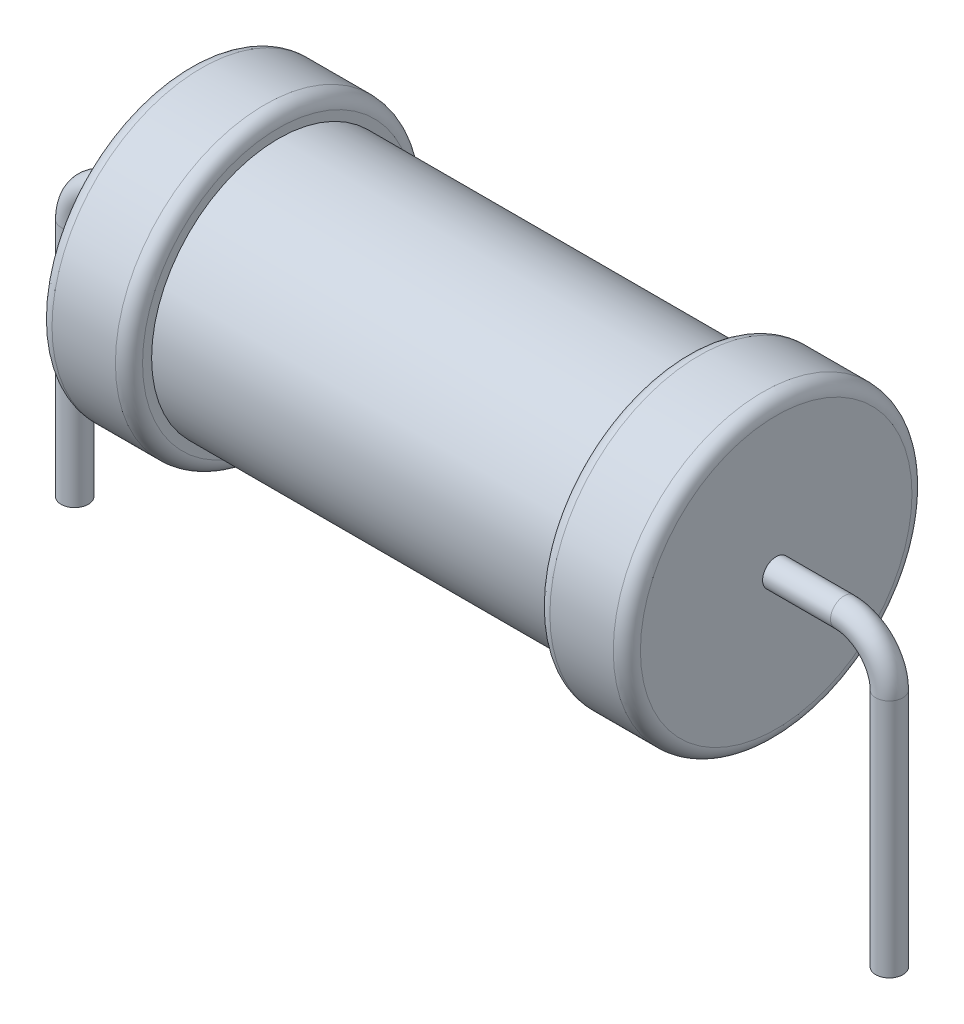
ISO-10303-21;
HEADER;
FILE_DESCRIPTION(('STEP AP214'),'2;1');
FILE_NAME('part.step','',(''),(''),'','','');
FILE_SCHEMA(('AUTOMOTIVE_DESIGN { 1 0 10303 214 1 1 1 1 }'));
ENDSEC;
DATA;
#1=APPLICATION_CONTEXT('core data for automotive mechanical design processes');
#2=APPLICATION_PROTOCOL_DEFINITION('international standard','automotive_design',2000,#1);
#3=PRODUCT_CONTEXT('',#1,'mechanical');
#4=PRODUCT('Part','Part','',(#3));
#5=PRODUCT_RELATED_PRODUCT_CATEGORY('part','',(#4));
#6=PRODUCT_DEFINITION_FORMATION('','',#4);
#7=PRODUCT_DEFINITION_CONTEXT('part definition',#1,'design');
#8=PRODUCT_DEFINITION('design','',#6,#7);
#9=PRODUCT_DEFINITION_SHAPE('','',#8);
#10=(LENGTH_UNIT() NAMED_UNIT(*) SI_UNIT(.MILLI.,.METRE.));
#11=(NAMED_UNIT(*) PLANE_ANGLE_UNIT() SI_UNIT($,.RADIAN.));
#12=(NAMED_UNIT(*) SI_UNIT($,.STERADIAN.) SOLID_ANGLE_UNIT());
#13=UNCERTAINTY_MEASURE_WITH_UNIT(LENGTH_MEASURE(1.E-05),#10,'distance_accuracy_value','');
#14=(GEOMETRIC_REPRESENTATION_CONTEXT(3) GLOBAL_UNCERTAINTY_ASSIGNED_CONTEXT((#13)) GLOBAL_UNIT_ASSIGNED_CONTEXT((#10,
#11,#12)) REPRESENTATION_CONTEXT('',''));
#15=CARTESIAN_POINT('',(0.,0.,0.));
#16=DIRECTION('',(0.,0.,1.));
#17=DIRECTION('',(1.,0.,0.));
#18=AXIS2_PLACEMENT_3D('',#15,#16,#17);
#19=CARTESIAN_POINT('',(0.,0.,0.));
#20=DIRECTION('',(1.,0.,0.));
#21=DIRECTION('',(0.,0.,-1.));
#22=AXIS2_PLACEMENT_3D('',#19,#20,#21);
#23=PLANE('',#22);
#24=CARTESIAN_POINT('',(0.,0.,0.));
#25=DIRECTION('',(1.,0.,0.));
#26=DIRECTION('',(0.,0.,-1.));
#27=AXIS2_PLACEMENT_3D('',#24,#25,#26);
#28=CIRCLE('',#27,3.);
#29=CARTESIAN_POINT('',(0.,0.,-3.));
#30=VERTEX_POINT('',#29);
#31=EDGE_CURVE('E10',#30,#30,#28,.F.);
#32=ORIENTED_EDGE('',*,*,#31,.T.);
#33=EDGE_LOOP('',(#32));
#34=FACE_BOUND('',#33,.T.);
#35=CARTESIAN_POINT('',(0.,0.,0.));
#36=DIRECTION('',(1.,0.,0.));
#37=DIRECTION('',(0.,0.,-1.));
#38=AXIS2_PLACEMENT_3D('',#35,#36,#37);
#39=CIRCLE('',#38,0.3);
#40=CARTESIAN_POINT('',(0.,0.,-0.3));
#41=VERTEX_POINT('',#40);
#42=EDGE_CURVE('E67',#41,#41,#39,.T.);
#43=ORIENTED_EDGE('',*,*,#42,.T.);
#44=EDGE_LOOP('',(#43));
#45=FACE_BOUND('',#44,.T.);
#46=ADVANCED_FACE('F31',(#34,#45),#23,.F.);
#47=CARTESIAN_POINT('',(0.,0.,0.));
#48=DIRECTION('',(-1.,0.,0.));
#49=DIRECTION('',(0.,0.,1.));
#50=AXIS2_PLACEMENT_3D('',#47,#48,#49);
#51=CYLINDRICAL_SURFACE('',#50,3.3);
#52=CARTESIAN_POINT('',(1.7,0.,0.));
#53=DIRECTION('',(-1.,0.,0.));
#54=DIRECTION('',(0.,0.,1.));
#55=AXIS2_PLACEMENT_3D('',#52,#53,#54);
#56=CIRCLE('',#55,3.3);
#57=CARTESIAN_POINT('',(1.7,0.,3.3));
#58=VERTEX_POINT('',#57);
#59=EDGE_CURVE('E42',#58,#58,#56,.T.);
#60=ORIENTED_EDGE('',*,*,#59,.T.);
#61=EDGE_LOOP('',(#60));
#62=FACE_BOUND('',#61,.T.);
#63=CARTESIAN_POINT('',(0.3,0.,0.));
#64=DIRECTION('',(1.,0.,0.));
#65=DIRECTION('',(0.,0.,-1.));
#66=AXIS2_PLACEMENT_3D('',#63,#64,#65);
#67=CIRCLE('',#66,3.3);
#68=CARTESIAN_POINT('',(0.3,0.,-3.3));
#69=VERTEX_POINT('',#68);
#70=EDGE_CURVE('E46',#69,#69,#67,.T.);
#71=ORIENTED_EDGE('',*,*,#70,.T.);
#72=EDGE_LOOP('',(#71));
#73=FACE_BOUND('',#72,.T.);
#74=ADVANCED_FACE('F115',(#62,#73),#51,.T.);
#75=CARTESIAN_POINT('',(2.,3.3,0.));
#76=DIRECTION('',(-1.,0.,0.));
#77=DIRECTION('',(0.,0.,1.));
#78=AXIS2_PLACEMENT_3D('',#75,#76,#77);
#79=PLANE('',#78);
#80=CARTESIAN_POINT('',(2.,0.,0.));
#81=DIRECTION('',(-1.,0.,0.));
#82=DIRECTION('',(0.,0.,1.));
#83=AXIS2_PLACEMENT_3D('',#80,#81,#82);
#84=CIRCLE('',#83,3.);
#85=CARTESIAN_POINT('',(2.,0.,3.));
#86=VERTEX_POINT('',#85);
#87=EDGE_CURVE('E38',#86,#86,#84,.F.);
#88=ORIENTED_EDGE('',*,*,#87,.T.);
#89=EDGE_LOOP('',(#88));
#90=FACE_BOUND('',#89,.T.);
#91=CARTESIAN_POINT('',(2.,0.,0.));
#92=DIRECTION('',(-1.,0.,0.));
#93=DIRECTION('',(0.,0.,1.));
#94=AXIS2_PLACEMENT_3D('',#91,#92,#93);
#95=CIRCLE('',#94,2.8);
#96=CARTESIAN_POINT('',(2.,0.,2.8));
#97=VERTEX_POINT('',#96);
#98=EDGE_CURVE('E63',#97,#97,#95,.T.);
#99=ORIENTED_EDGE('',*,*,#98,.T.);
#100=EDGE_LOOP('',(#99));
#101=FACE_BOUND('',#100,.T.);
#102=ADVANCED_FACE('F120',(#90,#101),#79,.F.);
#103=CARTESIAN_POINT('',(0.,0.,0.));
#104=DIRECTION('',(-1.,0.,0.));
#105=DIRECTION('',(0.,0.,1.));
#106=AXIS2_PLACEMENT_3D('',#103,#104,#105);
#107=CYLINDRICAL_SURFACE('',#106,2.8);
#108=ORIENTED_EDGE('',*,*,#98,.F.);
#109=EDGE_LOOP('',(#108));
#110=FACE_BOUND('',#109,.T.);
#111=CARTESIAN_POINT('',(11.,0.,0.));
#112=DIRECTION('',(-1.,0.,0.));
#113=DIRECTION('',(0.,0.,1.));
#114=AXIS2_PLACEMENT_3D('',#111,#112,#113);
#115=CIRCLE('',#114,2.8);
#116=CARTESIAN_POINT('',(11.,0.,2.8));
#117=VERTEX_POINT('',#116);
#118=EDGE_CURVE('E71',#117,#117,#115,.T.);
#119=ORIENTED_EDGE('',*,*,#118,.T.);
#120=EDGE_LOOP('',(#119));
#121=FACE_BOUND('',#120,.T.);
#122=ADVANCED_FACE('F192',(#110,#121),#107,.T.);
#123=CARTESIAN_POINT('',(11.,2.8,0.));
#124=DIRECTION('',(1.,0.,0.));
#125=DIRECTION('',(0.,0.,-1.));
#126=AXIS2_PLACEMENT_3D('',#123,#124,#125);
#127=PLANE('',#126);
#128=CARTESIAN_POINT('',(11.,0.,0.));
#129=DIRECTION('',(1.,0.,0.));
#130=DIRECTION('',(0.,0.,-1.));
#131=AXIS2_PLACEMENT_3D('',#128,#129,#130);
#132=CIRCLE('',#131,3.);
#133=CARTESIAN_POINT('',(11.,0.,-3.));
#134=VERTEX_POINT('',#133);
#135=EDGE_CURVE('E51',#134,#134,#132,.F.);
#136=ORIENTED_EDGE('',*,*,#135,.T.);
#137=EDGE_LOOP('',(#136));
#138=FACE_BOUND('',#137,.T.);
#139=ORIENTED_EDGE('',*,*,#118,.F.);
#140=EDGE_LOOP('',(#139));
#141=FACE_BOUND('',#140,.T.);
#142=ADVANCED_FACE('F182',(#138,#141),#127,.F.);
#143=CARTESIAN_POINT('',(0.,0.,0.));
#144=DIRECTION('',(-1.,0.,0.));
#145=DIRECTION('',(0.,0.,1.));
#146=AXIS2_PLACEMENT_3D('',#143,#144,#145);
#147=CYLINDRICAL_SURFACE('',#146,3.3);
#148=CARTESIAN_POINT('',(12.7,0.,0.));
#149=DIRECTION('',(-1.,0.,0.));
#150=DIRECTION('',(0.,0.,1.));
#151=AXIS2_PLACEMENT_3D('',#148,#149,#150);
#152=CIRCLE('',#151,3.3);
#153=CARTESIAN_POINT('',(12.7,0.,3.3));
#154=VERTEX_POINT('',#153);
#155=EDGE_CURVE('E57',#154,#154,#152,.T.);
#156=ORIENTED_EDGE('',*,*,#155,.T.);
#157=EDGE_LOOP('',(#156));
#158=FACE_BOUND('',#157,.T.);
#159=CARTESIAN_POINT('',(11.3,0.,0.));
#160=DIRECTION('',(1.,0.,0.));
#161=DIRECTION('',(0.,0.,-1.));
#162=AXIS2_PLACEMENT_3D('',#159,#160,#161);
#163=CIRCLE('',#162,3.3);
#164=CARTESIAN_POINT('',(11.3,0.,-3.3));
#165=VERTEX_POINT('',#164);
#166=EDGE_CURVE('E60',#165,#165,#163,.T.);
#167=ORIENTED_EDGE('',*,*,#166,.T.);
#168=EDGE_LOOP('',(#167));
#169=FACE_BOUND('',#168,.T.);
#170=ADVANCED_FACE('F170',(#158,#169),#147,.T.);
#171=CARTESIAN_POINT('',(13.,3.3,0.));
#172=DIRECTION('',(-1.,0.,0.));
#173=DIRECTION('',(0.,0.,1.));
#174=AXIS2_PLACEMENT_3D('',#171,#172,#173);
#175=PLANE('',#174);
#176=CARTESIAN_POINT('',(13.,0.,0.));
#177=DIRECTION('',(-1.,0.,0.));
#178=DIRECTION('',(0.,0.,1.));
#179=AXIS2_PLACEMENT_3D('',#176,#177,#178);
#180=CIRCLE('',#179,3.);
#181=CARTESIAN_POINT('',(13.,0.,3.));
#182=VERTEX_POINT('',#181);
#183=EDGE_CURVE('E54',#182,#182,#180,.F.);
#184=ORIENTED_EDGE('',*,*,#183,.T.);
#185=EDGE_LOOP('',(#184));
#186=FACE_BOUND('',#185,.T.);
#187=CARTESIAN_POINT('',(13.,0.,0.));
#188=DIRECTION('',(-1.,0.,0.));
#189=DIRECTION('',(0.,0.,1.));
#190=AXIS2_PLACEMENT_3D('',#187,#188,#189);
#191=CIRCLE('',#190,0.3);
#192=CARTESIAN_POINT('',(13.,0.,0.3));
#193=VERTEX_POINT('',#192);
#194=EDGE_CURVE('E64',#193,#193,#191,.T.);
#195=ORIENTED_EDGE('',*,*,#194,.T.);
#196=EDGE_LOOP('',(#195));
#197=FACE_BOUND('',#196,.T.);
#198=ADVANCED_FACE('F164',(#186,#197),#175,.F.);
#199=CARTESIAN_POINT('',(15.5,-6.3,0.));
#200=DIRECTION('',(0.,-1.,0.));
#201=DIRECTION('',(1.,0.,0.));
#202=AXIS2_PLACEMENT_3D('',#199,#200,#201);
#203=PLANE('',#202);
#204=CARTESIAN_POINT('',(15.5,-6.3,0.));
#205=DIRECTION('',(0.,-1.,0.));
#206=DIRECTION('',(1.,0.,0.));
#207=AXIS2_PLACEMENT_3D('',#204,#205,#206);
#208=CIRCLE('',#207,0.3);
#209=CARTESIAN_POINT('',(15.8,-6.3,0.));
#210=VERTEX_POINT('',#209);
#211=EDGE_CURVE('E68',#210,#210,#208,.T.);
#212=ORIENTED_EDGE('',*,*,#211,.T.);
#213=EDGE_LOOP('',(#212));
#214=FACE_BOUND('',#213,.T.);
#215=ADVANCED_FACE('F169',(#214),#203,.T.);
#216=CARTESIAN_POINT('',(15.5,-0.999999999999997,0.));
#217=DIRECTION('',(0.,-1.,0.));
#218=DIRECTION('',(1.,0.,0.));
#219=AXIS2_PLACEMENT_3D('',#216,#217,#218);
#220=CYLINDRICAL_SURFACE('',#219,0.3);
#221=CARTESIAN_POINT('',(15.5,-0.999999999999997,0.));
#222=DIRECTION('',(0.,-1.,0.));
#223=DIRECTION('',(1.,0.,0.));
#224=AXIS2_PLACEMENT_3D('',#221,#222,#223);
#225=CIRCLE('',#224,0.3);
#226=CARTESIAN_POINT('',(15.8,-0.999999999999997,0.));
#227=VERTEX_POINT('',#226);
#228=EDGE_CURVE('E78',#227,#227,#225,.T.);
#229=ORIENTED_EDGE('',*,*,#228,.T.);
#230=EDGE_LOOP('',(#229));
#231=FACE_BOUND('',#230,.T.);
#232=ORIENTED_EDGE('',*,*,#211,.F.);
#233=EDGE_LOOP('',(#232));
#234=FACE_BOUND('',#233,.T.);
#235=ADVANCED_FACE('F258',(#231,#234),#220,.T.);
#236=CARTESIAN_POINT('',(14.5,-0.999999999999998,0.));
#237=DIRECTION('',(0.,0.,-1.));
#238=DIRECTION('',(-1.,0.,0.));
#239=AXIS2_PLACEMENT_3D('',#236,#237,#238);
#240=TOROIDAL_SURFACE('',#239,1.,0.3);
#241=CARTESIAN_POINT('',(14.5,0.,0.));
#242=DIRECTION('',(1.,0.,0.));
#243=DIRECTION('',(0.,1.,0.));
#244=AXIS2_PLACEMENT_3D('',#241,#242,#243);
#245=CIRCLE('',#244,0.3);
#246=CARTESIAN_POINT('',(14.5,0.300000000000003,0.));
#247=VERTEX_POINT('',#246);
#248=EDGE_CURVE('E81',#247,#247,#245,.T.);
#249=CARTESIAN_POINT('',(14.5,-0.999999999999998,0.));
#250=DIRECTION('',(0.,0.,-1.));
#251=DIRECTION('',(-1.,0.,0.));
#252=AXIS2_PLACEMENT_3D('',#249,#250,#251);
#253=CIRCLE('',#252,1.3);
#254=EDGE_CURVE('',#247,#227,#253,.T.);
#255=ORIENTED_EDGE('',*,*,#248,.T.);
#256=ORIENTED_EDGE('',*,*,#228,.F.);
#257=ORIENTED_EDGE('',*,*,#254,.T.);
#258=ORIENTED_EDGE('',*,*,#254,.F.);
#259=EDGE_LOOP('',(#255,#257,#256,#258));
#260=FACE_BOUND('',#259,.T.);
#261=ADVANCED_FACE('F249',(#260),#240,.T.);
#262=CARTESIAN_POINT('',(-1.5,0.,0.));
#263=DIRECTION('',(1.,0.,0.));
#264=DIRECTION('',(0.,1.,0.));
#265=AXIS2_PLACEMENT_3D('',#262,#263,#264);
#266=CYLINDRICAL_SURFACE('',#265,0.3);
#267=ORIENTED_EDGE('',*,*,#248,.F.);
#268=EDGE_LOOP('',(#267));
#269=FACE_BOUND('',#268,.T.);
#270=ORIENTED_EDGE('',*,*,#194,.F.);
#271=EDGE_LOOP('',(#270));
#272=FACE_BOUND('',#271,.T.);
#273=ADVANCED_FACE('F239',(#269,#272),#266,.T.);
#274=CARTESIAN_POINT('',(-1.5,0.,0.));
#275=DIRECTION('',(1.,0.,0.));
#276=DIRECTION('',(0.,1.,0.));
#277=AXIS2_PLACEMENT_3D('',#274,#275,#276);
#278=CIRCLE('',#277,0.3);
#279=CARTESIAN_POINT('',(-1.5,0.300000000000001,0.));
#280=VERTEX_POINT('',#279);
#281=EDGE_CURVE('E84',#280,#280,#278,.T.);
#282=ORIENTED_EDGE('',*,*,#281,.T.);
#283=EDGE_LOOP('',(#282));
#284=FACE_BOUND('',#283,.T.);
#285=ORIENTED_EDGE('',*,*,#42,.F.);
#286=EDGE_LOOP('',(#285));
#287=FACE_BOUND('',#286,.T.);
#288=ADVANCED_FACE('F230',(#284,#287),#266,.T.);
#289=CARTESIAN_POINT('',(-1.5,-1.,0.));
#290=DIRECTION('',(0.,0.,-1.));
#291=DIRECTION('',(-1.,0.,0.));
#292=AXIS2_PLACEMENT_3D('',#289,#290,#291);
#293=TOROIDAL_SURFACE('',#292,1.,0.3);
#294=CARTESIAN_POINT('',(-2.5,-1.,0.));
#295=DIRECTION('',(0.,1.,0.));
#296=DIRECTION('',(-1.,0.,0.));
#297=AXIS2_PLACEMENT_3D('',#294,#295,#296);
#298=CIRCLE('',#297,0.3);
#299=CARTESIAN_POINT('',(-2.8,-1.,0.));
#300=VERTEX_POINT('',#299);
#301=EDGE_CURVE('E87',#300,#300,#298,.T.);
#302=CARTESIAN_POINT('',(-1.5,-1.,0.));
#303=DIRECTION('',(0.,0.,-1.));
#304=DIRECTION('',(-1.,0.,0.));
#305=AXIS2_PLACEMENT_3D('',#302,#303,#304);
#306=CIRCLE('',#305,1.3);
#307=EDGE_CURVE('',#300,#280,#306,.T.);
#308=ORIENTED_EDGE('',*,*,#301,.T.);
#309=ORIENTED_EDGE('',*,*,#281,.F.);
#310=ORIENTED_EDGE('',*,*,#307,.T.);
#311=ORIENTED_EDGE('',*,*,#307,.F.);
#312=EDGE_LOOP('',(#308,#310,#309,#311));
#313=FACE_BOUND('',#312,.T.);
#314=ADVANCED_FACE('F94',(#313),#293,.T.);
#315=CARTESIAN_POINT('',(-2.5,-1.,0.));
#316=DIRECTION('',(0.,-1.,0.));
#317=DIRECTION('',(1.,0.,0.));
#318=AXIS2_PLACEMENT_3D('',#315,#316,#317);
#319=CYLINDRICAL_SURFACE('',#318,0.3);
#320=ORIENTED_EDGE('',*,*,#301,.F.);
#321=EDGE_LOOP('',(#320));
#322=FACE_BOUND('',#321,.T.);
#323=CARTESIAN_POINT('',(-2.5,-6.3,0.));
#324=DIRECTION('',(0.,1.,0.));
#325=DIRECTION('',(-1.,0.,0.));
#326=AXIS2_PLACEMENT_3D('',#323,#324,#325);
#327=CIRCLE('',#326,0.3);
#328=CARTESIAN_POINT('',(-2.8,-6.3,0.));
#329=VERTEX_POINT('',#328);
#330=EDGE_CURVE('E88',#329,#329,#327,.T.);
#331=ORIENTED_EDGE('',*,*,#330,.T.);
#332=EDGE_LOOP('',(#331));
#333=FACE_BOUND('',#332,.T.);
#334=ADVANCED_FACE('F97',(#322,#333),#319,.T.);
#335=CARTESIAN_POINT('',(-2.5,-6.3,0.));
#336=DIRECTION('',(0.,1.,0.));
#337=DIRECTION('',(-1.,0.,0.));
#338=AXIS2_PLACEMENT_3D('',#335,#336,#337);
#339=PLANE('',#338);
#340=ORIENTED_EDGE('',*,*,#330,.F.);
#341=EDGE_LOOP('',(#340));
#342=FACE_BOUND('',#341,.T.);
#343=ADVANCED_FACE('F100',(#342),#339,.F.);
#344=CARTESIAN_POINT('',(12.7,0.,0.));
#345=DIRECTION('',(-1.,0.,0.));
#346=DIRECTION('',(0.,0.,1.));
#347=AXIS2_PLACEMENT_3D('',#344,#345,#346);
#348=TOROIDAL_SURFACE('',#347,3.,0.3);
#349=ORIENTED_EDGE('',*,*,#183,.F.);
#350=EDGE_LOOP('',(#349));
#351=FACE_BOUND('',#350,.T.);
#352=ORIENTED_EDGE('',*,*,#155,.F.);
#353=EDGE_LOOP('',(#352));
#354=FACE_BOUND('',#353,.T.);
#355=ADVANCED_FACE('F105',(#351,#354),#348,.T.);
#356=CARTESIAN_POINT('',(11.3,0.,0.));
#357=DIRECTION('',(1.,0.,0.));
#358=DIRECTION('',(0.,0.,-1.));
#359=AXIS2_PLACEMENT_3D('',#356,#357,#358);
#360=TOROIDAL_SURFACE('',#359,3.,0.3);
#361=ORIENTED_EDGE('',*,*,#166,.F.);
#362=EDGE_LOOP('',(#361));
#363=FACE_BOUND('',#362,.T.);
#364=ORIENTED_EDGE('',*,*,#135,.F.);
#365=EDGE_LOOP('',(#364));
#366=FACE_BOUND('',#365,.T.);
#367=ADVANCED_FACE('F110',(#363,#366),#360,.T.);
#368=CARTESIAN_POINT('',(1.7,0.,0.));
#369=DIRECTION('',(-1.,0.,0.));
#370=DIRECTION('',(0.,0.,1.));
#371=AXIS2_PLACEMENT_3D('',#368,#369,#370);
#372=TOROIDAL_SURFACE('',#371,3.,0.3);
#373=ORIENTED_EDGE('',*,*,#87,.F.);
#374=EDGE_LOOP('',(#373));
#375=FACE_BOUND('',#374,.T.);
#376=ORIENTED_EDGE('',*,*,#59,.F.);
#377=EDGE_LOOP('',(#376));
#378=FACE_BOUND('',#377,.T.);
#379=ADVANCED_FACE('F127',(#375,#378),#372,.T.);
#380=CARTESIAN_POINT('',(0.3,0.,0.));
#381=DIRECTION('',(1.,0.,0.));
#382=DIRECTION('',(0.,0.,-1.));
#383=AXIS2_PLACEMENT_3D('',#380,#381,#382);
#384=TOROIDAL_SURFACE('',#383,3.,0.3);
#385=ORIENTED_EDGE('',*,*,#70,.F.);
#386=EDGE_LOOP('',(#385));
#387=FACE_BOUND('',#386,.T.);
#388=ORIENTED_EDGE('',*,*,#31,.F.);
#389=EDGE_LOOP('',(#388));
#390=FACE_BOUND('',#389,.T.);
#391=ADVANCED_FACE('F33',(#387,#390),#384,.T.);
#392=CLOSED_SHELL('',(#46,#74,#102,#122,#142,#170,#198,#215,#235,#261,#273,#288,#314,#334,#343,
#355,#367,#379,#391));
#393=MANIFOLD_SOLID_BREP('B2',#392);
#394=ADVANCED_BREP_SHAPE_REPRESENTATION('',(#18,#393),#14);
#395=SHAPE_DEFINITION_REPRESENTATION(#9,#394);
ENDSEC;
END-ISO-10303-21;
